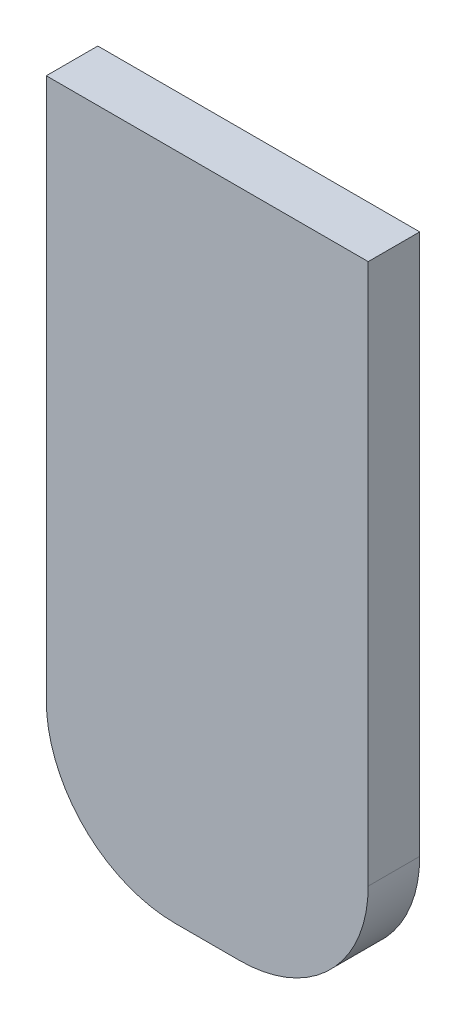
ISO-10303-21;
HEADER;
FILE_DESCRIPTION(('STEP AP214'),'2;1');
FILE_NAME('part.step','',(''),(''),'','','');
FILE_SCHEMA(('AUTOMOTIVE_DESIGN { 1 0 10303 214 1 1 1 1 }'));
ENDSEC;
DATA;
#1=APPLICATION_CONTEXT('core data for automotive mechanical design processes');
#2=APPLICATION_PROTOCOL_DEFINITION('international standard','automotive_design',2000,#1);
#3=PRODUCT_CONTEXT('',#1,'mechanical');
#4=PRODUCT('Part','Part','',(#3));
#5=PRODUCT_RELATED_PRODUCT_CATEGORY('part','',(#4));
#6=PRODUCT_DEFINITION_FORMATION('','',#4);
#7=PRODUCT_DEFINITION_CONTEXT('part definition',#1,'design');
#8=PRODUCT_DEFINITION('design','',#6,#7);
#9=PRODUCT_DEFINITION_SHAPE('','',#8);
#10=(LENGTH_UNIT() NAMED_UNIT(*) SI_UNIT(.MILLI.,.METRE.));
#11=(NAMED_UNIT(*) PLANE_ANGLE_UNIT() SI_UNIT($,.RADIAN.));
#12=(NAMED_UNIT(*) SI_UNIT($,.STERADIAN.) SOLID_ANGLE_UNIT());
#13=UNCERTAINTY_MEASURE_WITH_UNIT(LENGTH_MEASURE(1.E-05),#10,'distance_accuracy_value','');
#14=(GEOMETRIC_REPRESENTATION_CONTEXT(3) GLOBAL_UNCERTAINTY_ASSIGNED_CONTEXT((#13)) GLOBAL_UNIT_ASSIGNED_CONTEXT((#10,
#11,#12)) REPRESENTATION_CONTEXT('',''));
#15=CARTESIAN_POINT('',(0.,0.,0.));
#16=DIRECTION('',(0.,0.,1.));
#17=DIRECTION('',(1.,0.,0.));
#18=AXIS2_PLACEMENT_3D('',#15,#16,#17);
#19=CARTESIAN_POINT('',(0.,0.,5.08));
#20=DIRECTION('',(1.,0.,0.));
#21=DIRECTION('',(0.,0.,-1.));
#22=AXIS2_PLACEMENT_3D('',#19,#20,#21);
#23=PLANE('',#22);
#24=DIRECTION('',(0.,-1.,0.));
#25=VECTOR('',#24,1.);
#26=CARTESIAN_POINT('',(0.,0.,0.));
#27=LINE('',#26,#25);
#28=CARTESIAN_POINT('',(0.,66.04,0.));
#29=VERTEX_POINT('',#28);
#30=CARTESIAN_POINT('',(0.,12.7,0.));
#31=VERTEX_POINT('',#30);
#32=EDGE_CURVE('E112',#29,#31,#27,.T.);
#33=ORIENTED_EDGE('',*,*,#32,.T.);
#34=DIRECTION('',(0.,0.,-1.));
#35=VECTOR('',#34,1.);
#36=CARTESIAN_POINT('',(0.,12.7,5.08));
#37=LINE('',#36,#35);
#38=CARTESIAN_POINT('',(0.,12.7,5.08));
#39=VERTEX_POINT('',#38);
#40=EDGE_CURVE('E56',#31,#39,#37,.F.);
#41=ORIENTED_EDGE('',*,*,#40,.T.);
#42=DIRECTION('',(0.,-1.,0.));
#43=VECTOR('',#42,1.);
#44=CARTESIAN_POINT('',(0.,0.,5.08));
#45=LINE('',#44,#43);
#46=CARTESIAN_POINT('',(0.,66.04,5.08));
#47=VERTEX_POINT('',#46);
#48=EDGE_CURVE('E119',#47,#39,#45,.T.);
#49=ORIENTED_EDGE('',*,*,#48,.F.);
#50=DIRECTION('',(0.,0.,-1.));
#51=VECTOR('',#50,1.);
#52=CARTESIAN_POINT('',(0.,66.04,5.08));
#53=LINE('',#52,#51);
#54=EDGE_CURVE('E104',#47,#29,#53,.T.);
#55=ORIENTED_EDGE('',*,*,#54,.T.);
#56=EDGE_LOOP('',(#33,#41,#49,#55));
#57=FACE_BOUND('',#56,.T.);
#58=ADVANCED_FACE('F33',(#57),#23,.F.);
#59=CARTESIAN_POINT('',(0.,0.,5.08));
#60=DIRECTION('',(0.,1.,0.));
#61=DIRECTION('',(0.,0.,1.));
#62=AXIS2_PLACEMENT_3D('',#59,#60,#61);
#63=PLANE('',#62);
#64=DIRECTION('',(1.,0.,0.));
#65=VECTOR('',#64,1.);
#66=CARTESIAN_POINT('',(0.,0.,5.08));
#67=LINE('',#66,#65);
#68=CARTESIAN_POINT('',(12.7,0.,5.08));
#69=VERTEX_POINT('',#68);
#70=CARTESIAN_POINT('',(19.05,0.,5.08));
#71=VERTEX_POINT('',#70);
#72=EDGE_CURVE('E94',#69,#71,#67,.T.);
#73=ORIENTED_EDGE('',*,*,#72,.F.);
#74=DIRECTION('',(0.,0.,-1.));
#75=VECTOR('',#74,1.);
#76=CARTESIAN_POINT('',(12.7,0.,5.08));
#77=LINE('',#76,#75);
#78=CARTESIAN_POINT('',(12.7,0.,0.));
#79=VERTEX_POINT('',#78);
#80=EDGE_CURVE('E122',#69,#79,#77,.T.);
#81=ORIENTED_EDGE('',*,*,#80,.T.);
#82=DIRECTION('',(1.,0.,0.));
#83=VECTOR('',#82,1.);
#84=CARTESIAN_POINT('',(0.,0.,0.));
#85=LINE('',#84,#83);
#86=CARTESIAN_POINT('',(19.05,0.,0.));
#87=VERTEX_POINT('',#86);
#88=EDGE_CURVE('E114',#79,#87,#85,.T.);
#89=ORIENTED_EDGE('',*,*,#88,.T.);
#90=DIRECTION('',(0.,0.,-1.));
#91=VECTOR('',#90,1.);
#92=CARTESIAN_POINT('',(19.05,0.,5.08));
#93=LINE('',#92,#91);
#94=EDGE_CURVE('E103',#87,#71,#93,.F.);
#95=ORIENTED_EDGE('',*,*,#94,.T.);
#96=EDGE_LOOP('',(#73,#81,#89,#95));
#97=FACE_BOUND('',#96,.T.);
#98=ADVANCED_FACE('F135',(#97),#63,.F.);
#99=CARTESIAN_POINT('',(31.75,0.,5.08));
#100=DIRECTION('',(-1.,0.,0.));
#101=DIRECTION('',(0.,0.,1.));
#102=AXIS2_PLACEMENT_3D('',#99,#100,#101);
#103=PLANE('',#102);
#104=DIRECTION('',(0.,1.,0.));
#105=VECTOR('',#104,1.);
#106=CARTESIAN_POINT('',(31.75,0.,5.08));
#107=LINE('',#106,#105);
#108=CARTESIAN_POINT('',(31.75,12.7,5.08));
#109=VERTEX_POINT('',#108);
#110=CARTESIAN_POINT('',(31.75,66.04,5.08));
#111=VERTEX_POINT('',#110);
#112=EDGE_CURVE('E86',#109,#111,#107,.T.);
#113=ORIENTED_EDGE('',*,*,#112,.F.);
#114=DIRECTION('',(0.,0.,-1.));
#115=VECTOR('',#114,1.);
#116=CARTESIAN_POINT('',(31.75,12.7,5.08));
#117=LINE('',#116,#115);
#118=CARTESIAN_POINT('',(31.75,12.7,0.));
#119=VERTEX_POINT('',#118);
#120=EDGE_CURVE('E11',#109,#119,#117,.T.);
#121=ORIENTED_EDGE('',*,*,#120,.T.);
#122=DIRECTION('',(0.,1.,0.));
#123=VECTOR('',#122,1.);
#124=CARTESIAN_POINT('',(31.75,0.,0.));
#125=LINE('',#124,#123);
#126=CARTESIAN_POINT('',(31.75,66.04,0.));
#127=VERTEX_POINT('',#126);
#128=EDGE_CURVE('E100',#119,#127,#125,.T.);
#129=ORIENTED_EDGE('',*,*,#128,.T.);
#130=DIRECTION('',(0.,0.,-1.));
#131=VECTOR('',#130,1.);
#132=CARTESIAN_POINT('',(31.75,66.04,5.08));
#133=LINE('',#132,#131);
#134=EDGE_CURVE('E97',#111,#127,#133,.T.);
#135=ORIENTED_EDGE('',*,*,#134,.F.);
#136=EDGE_LOOP('',(#113,#121,#129,#135));
#137=FACE_BOUND('',#136,.T.);
#138=ADVANCED_FACE('F98',(#137),#103,.F.);
#139=CARTESIAN_POINT('',(0.,66.04,5.08));
#140=DIRECTION('',(0.,-1.,0.));
#141=DIRECTION('',(0.,0.,-1.));
#142=AXIS2_PLACEMENT_3D('',#139,#140,#141);
#143=PLANE('',#142);
#144=DIRECTION('',(-1.,0.,0.));
#145=VECTOR('',#144,1.);
#146=CARTESIAN_POINT('',(0.,66.04,0.));
#147=LINE('',#146,#145);
#148=EDGE_CURVE('E118',#127,#29,#147,.T.);
#149=ORIENTED_EDGE('',*,*,#148,.T.);
#150=ORIENTED_EDGE('',*,*,#54,.F.);
#151=DIRECTION('',(-1.,0.,0.));
#152=VECTOR('',#151,1.);
#153=CARTESIAN_POINT('',(0.,66.04,5.08));
#154=LINE('',#153,#152);
#155=EDGE_CURVE('E90',#111,#47,#154,.T.);
#156=ORIENTED_EDGE('',*,*,#155,.F.);
#157=ORIENTED_EDGE('',*,*,#134,.T.);
#158=EDGE_LOOP('',(#149,#150,#156,#157));
#159=FACE_BOUND('',#158,.T.);
#160=ADVANCED_FACE('F106',(#159),#143,.F.);
#161=CARTESIAN_POINT('',(0.,0.,5.08));
#162=DIRECTION('',(0.,0.,-1.));
#163=DIRECTION('',(-1.,0.,0.));
#164=AXIS2_PLACEMENT_3D('',#161,#162,#163);
#165=PLANE('',#164);
#166=ORIENTED_EDGE('',*,*,#48,.T.);
#167=CARTESIAN_POINT('',(12.7,12.7,5.08));
#168=DIRECTION('',(0.,0.,-1.));
#169=DIRECTION('',(-1.,0.,0.));
#170=AXIS2_PLACEMENT_3D('',#167,#168,#169);
#171=CIRCLE('',#170,12.7);
#172=EDGE_CURVE('E41',#39,#69,#171,.F.);
#173=ORIENTED_EDGE('',*,*,#172,.T.);
#174=ORIENTED_EDGE('',*,*,#72,.T.);
#175=CARTESIAN_POINT('',(19.05,12.7,5.08));
#176=DIRECTION('',(0.,0.,-1.));
#177=DIRECTION('',(-1.,0.,0.));
#178=AXIS2_PLACEMENT_3D('',#175,#176,#177);
#179=CIRCLE('',#178,12.7);
#180=EDGE_CURVE('E48',#71,#109,#179,.F.);
#181=ORIENTED_EDGE('',*,*,#180,.T.);
#182=ORIENTED_EDGE('',*,*,#112,.T.);
#183=ORIENTED_EDGE('',*,*,#155,.T.);
#184=EDGE_LOOP('',(#166,#173,#174,#181,#182,#183));
#185=FACE_BOUND('',#184,.T.);
#186=ADVANCED_FACE('F88',(#185),#165,.F.);
#187=CARTESIAN_POINT('',(0.,0.,0.));
#188=DIRECTION('',(0.,0.,-1.));
#189=DIRECTION('',(-1.,0.,0.));
#190=AXIS2_PLACEMENT_3D('',#187,#188,#189);
#191=PLANE('',#190);
#192=ORIENTED_EDGE('',*,*,#88,.F.);
#193=CARTESIAN_POINT('',(12.7,12.7,0.));
#194=DIRECTION('',(0.,0.,-1.));
#195=DIRECTION('',(-1.,0.,0.));
#196=AXIS2_PLACEMENT_3D('',#193,#194,#195);
#197=CIRCLE('',#196,12.7);
#198=EDGE_CURVE('E127',#79,#31,#197,.T.);
#199=ORIENTED_EDGE('',*,*,#198,.T.);
#200=ORIENTED_EDGE('',*,*,#32,.F.);
#201=ORIENTED_EDGE('',*,*,#148,.F.);
#202=ORIENTED_EDGE('',*,*,#128,.F.);
#203=CARTESIAN_POINT('',(19.05,12.7,0.));
#204=DIRECTION('',(0.,0.,-1.));
#205=DIRECTION('',(-1.,0.,0.));
#206=AXIS2_PLACEMENT_3D('',#203,#204,#205);
#207=CIRCLE('',#206,12.7);
#208=EDGE_CURVE('E125',#119,#87,#207,.T.);
#209=ORIENTED_EDGE('',*,*,#208,.T.);
#210=EDGE_LOOP('',(#192,#199,#200,#201,#202,#209));
#211=FACE_BOUND('',#210,.T.);
#212=ADVANCED_FACE('F141',(#211),#191,.T.);
#213=CARTESIAN_POINT('',(12.7,12.7,5.08));
#214=DIRECTION('',(0.,0.,-1.));
#215=DIRECTION('',(-1.,0.,0.));
#216=AXIS2_PLACEMENT_3D('',#213,#214,#215);
#217=CYLINDRICAL_SURFACE('',#216,12.7);
#218=ORIENTED_EDGE('',*,*,#172,.F.);
#219=ORIENTED_EDGE('',*,*,#40,.F.);
#220=ORIENTED_EDGE('',*,*,#198,.F.);
#221=ORIENTED_EDGE('',*,*,#80,.F.);
#222=EDGE_LOOP('',(#218,#219,#220,#221));
#223=FACE_BOUND('',#222,.T.);
#224=ADVANCED_FACE('F138',(#223),#217,.T.);
#225=CARTESIAN_POINT('',(19.05,12.7,5.08));
#226=DIRECTION('',(0.,0.,-1.));
#227=DIRECTION('',(-1.,0.,0.));
#228=AXIS2_PLACEMENT_3D('',#225,#226,#227);
#229=CYLINDRICAL_SURFACE('',#228,12.7);
#230=ORIENTED_EDGE('',*,*,#180,.F.);
#231=ORIENTED_EDGE('',*,*,#94,.F.);
#232=ORIENTED_EDGE('',*,*,#208,.F.);
#233=ORIENTED_EDGE('',*,*,#120,.F.);
#234=EDGE_LOOP('',(#230,#231,#232,#233));
#235=FACE_BOUND('',#234,.T.);
#236=ADVANCED_FACE('F35',(#235),#229,.T.);
#237=CLOSED_SHELL('',(#58,#98,#138,#160,#186,#212,#224,#236));
#238=MANIFOLD_SOLID_BREP('B2',#237);
#239=ADVANCED_BREP_SHAPE_REPRESENTATION('',(#18,#238),#14);
#240=SHAPE_DEFINITION_REPRESENTATION(#9,#239);
ENDSEC;
END-ISO-10303-21;
